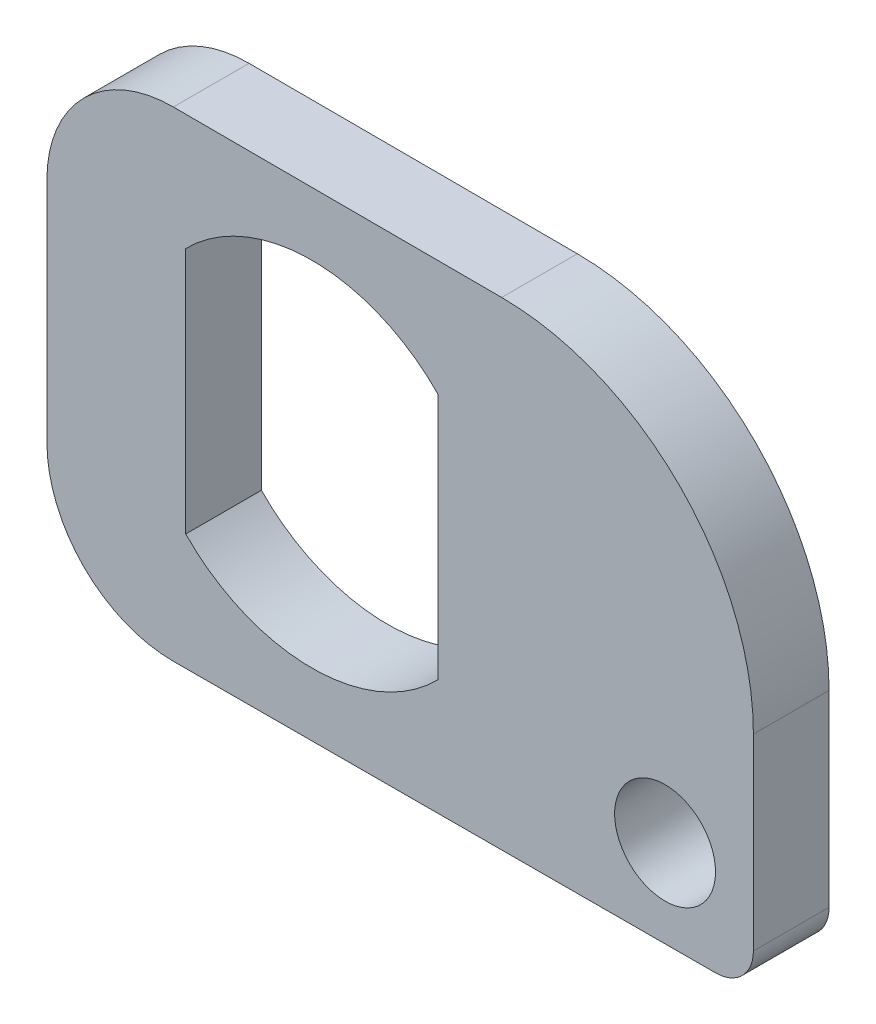
ISO-10303-21;
HEADER;
FILE_DESCRIPTION(('STEP AP214'),'2;1');
FILE_NAME('part.step','',(''),(''),'','','');
FILE_SCHEMA(('AUTOMOTIVE_DESIGN { 1 0 10303 214 1 1 1 1 }'));
ENDSEC;
DATA;
#1=APPLICATION_CONTEXT('core data for automotive mechanical design processes');
#2=APPLICATION_PROTOCOL_DEFINITION('international standard','automotive_design',2000,#1);
#3=PRODUCT_CONTEXT('',#1,'mechanical');
#4=PRODUCT('Part','Part','',(#3));
#5=PRODUCT_RELATED_PRODUCT_CATEGORY('part','',(#4));
#6=PRODUCT_DEFINITION_FORMATION('','',#4);
#7=PRODUCT_DEFINITION_CONTEXT('part definition',#1,'design');
#8=PRODUCT_DEFINITION('design','',#6,#7);
#9=PRODUCT_DEFINITION_SHAPE('','',#8);
#10=(LENGTH_UNIT() NAMED_UNIT(*) SI_UNIT(.MILLI.,.METRE.));
#11=(NAMED_UNIT(*) PLANE_ANGLE_UNIT() SI_UNIT($,.RADIAN.));
#12=(NAMED_UNIT(*) SI_UNIT($,.STERADIAN.) SOLID_ANGLE_UNIT());
#13=UNCERTAINTY_MEASURE_WITH_UNIT(LENGTH_MEASURE(1.E-05),#10,'distance_accuracy_value','');
#14=(GEOMETRIC_REPRESENTATION_CONTEXT(3) GLOBAL_UNCERTAINTY_ASSIGNED_CONTEXT((#13)) GLOBAL_UNIT_ASSIGNED_CONTEXT((#10,
#11,#12)) REPRESENTATION_CONTEXT('',''));
#15=CARTESIAN_POINT('',(0.,0.,0.));
#16=DIRECTION('',(0.,0.,1.));
#17=DIRECTION('',(1.,0.,0.));
#18=AXIS2_PLACEMENT_3D('',#15,#16,#17);
#19=CARTESIAN_POINT('',(-11.,-9.02618778250141,6.));
#20=DIRECTION('',(0.,0.,-1.));
#21=DIRECTION('',(-1.,0.,0.));
#22=AXIS2_PLACEMENT_3D('',#19,#20,#21);
#23=PLANE('',#22);
#24=CARTESIAN_POINT('',(-11.,-9.02618778250141,6.));
#25=DIRECTION('',(0.,0.,1.));
#26=DIRECTION('',(-1.,0.,0.));
#27=AXIS2_PLACEMENT_3D('',#24,#25,#26);
#28=CIRCLE('',#27,10.);
#29=CARTESIAN_POINT('',(-21.,-9.02618778250134,6.));
#30=VERTEX_POINT('',#29);
#31=CARTESIAN_POINT('',(-10.9762161335063,-19.0261594988461,6.));
#32=VERTEX_POINT('',#31);
#33=EDGE_CURVE('E165',#30,#32,#28,.T.);
#34=ORIENTED_EDGE('',*,*,#33,.T.);
#35=DIRECTION('',(0.999997171634473,0.00237838664936815,0.));
#36=VECTOR('',#35,1.);
#37=CARTESIAN_POINT('',(32.0071351599481,-18.9239281808372,6.));
#38=LINE('',#37,#36);
#39=CARTESIAN_POINT('',(32.0071351599481,-18.9239281808372,6.));
#40=VERTEX_POINT('',#39);
#41=EDGE_CURVE('E168',#32,#40,#38,.T.);
#42=ORIENTED_EDGE('',*,*,#41,.T.);
#43=CARTESIAN_POINT('',(32.,-15.9239366659337,6.));
#44=DIRECTION('',(0.,0.,1.));
#45=DIRECTION('',(1.,0.,0.));
#46=AXIS2_PLACEMENT_3D('',#43,#44,#45);
#47=CIRCLE('',#46,3.);
#48=CARTESIAN_POINT('',(35.,-15.9239366659337,6.));
#49=VERTEX_POINT('',#48);
#50=EDGE_CURVE('E171',#40,#49,#47,.T.);
#51=ORIENTED_EDGE('',*,*,#50,.T.);
#52=DIRECTION('',(0.,1.,0.));
#53=VECTOR('',#52,1.);
#54=CARTESIAN_POINT('',(35.,-1.03567872901867,6.));
#55=LINE('',#54,#53);
#56=CARTESIAN_POINT('',(35.,-1.03567872901867,6.));
#57=VERTEX_POINT('',#56);
#58=EDGE_CURVE('E173',#49,#57,#55,.T.);
#59=ORIENTED_EDGE('',*,*,#58,.T.);
#60=CARTESIAN_POINT('',(15.,-1.03567872901854,6.));
#61=DIRECTION('',(0.,0.,1.));
#62=DIRECTION('',(-1.,0.,0.));
#63=AXIS2_PLACEMENT_3D('',#60,#61,#62);
#64=CIRCLE('',#63,20.);
#65=CARTESIAN_POINT('',(15.0475677329872,18.9642647036709,6.));
#66=VERTEX_POINT('',#65);
#67=EDGE_CURVE('E175',#57,#66,#64,.T.);
#68=ORIENTED_EDGE('',*,*,#67,.T.);
#69=DIRECTION('',(-0.999997171634473,0.00237838664936795,0.));
#70=VECTOR('',#69,1.);
#71=CARTESIAN_POINT('',(15.0475677329872,18.9642647036709,6.));
#72=LINE('',#71,#70);
#73=CARTESIAN_POINT('',(-10.9762161335063,19.0261594988461,6.));
#74=VERTEX_POINT('',#73);
#75=EDGE_CURVE('E177',#66,#74,#72,.T.);
#76=ORIENTED_EDGE('',*,*,#75,.T.);
#77=CARTESIAN_POINT('',(-11.,9.02618778250141,6.));
#78=DIRECTION('',(0.,0.,1.));
#79=DIRECTION('',(1.,0.,0.));
#80=AXIS2_PLACEMENT_3D('',#77,#78,#79);
#81=CIRCLE('',#80,10.);
#82=CARTESIAN_POINT('',(-21.,9.02618778250135,6.));
#83=VERTEX_POINT('',#82);
#84=EDGE_CURVE('E179',#74,#83,#81,.T.);
#85=ORIENTED_EDGE('',*,*,#84,.T.);
#86=DIRECTION('',(0.,-1.,0.));
#87=VECTOR('',#86,1.);
#88=CARTESIAN_POINT('',(-21.,9.02618778250134,6.));
#89=LINE('',#88,#87);
#90=EDGE_CURVE('E181',#83,#30,#89,.T.);
#91=ORIENTED_EDGE('',*,*,#90,.T.);
#92=EDGE_LOOP('',(#34,#42,#51,#59,#68,#76,#85,#91));
#93=FACE_BOUND('',#92,.T.);
#94=CARTESIAN_POINT('',(0.,0.,6.));
#95=DIRECTION('',(0.,0.,1.));
#96=DIRECTION('',(1.,0.,0.));
#97=AXIS2_PLACEMENT_3D('',#94,#95,#96);
#98=CIRCLE('',#97,14.);
#99=CARTESIAN_POINT('',(10.,9.79795897113272,6.));
#100=VERTEX_POINT('',#99);
#101=CARTESIAN_POINT('',(-10.,9.79795897113272,6.));
#102=VERTEX_POINT('',#101);
#103=EDGE_CURVE('E126',#100,#102,#98,.T.);
#104=ORIENTED_EDGE('',*,*,#103,.F.);
#105=DIRECTION('',(0.,1.,0.));
#106=VECTOR('',#105,1.);
#107=CARTESIAN_POINT('',(10.,9.79795897113272,6.));
#108=LINE('',#107,#106);
#109=CARTESIAN_POINT('',(10.,-9.79795897113271,6.));
#110=VERTEX_POINT('',#109);
#111=EDGE_CURVE('E149',#110,#100,#108,.T.);
#112=ORIENTED_EDGE('',*,*,#111,.F.);
#113=CARTESIAN_POINT('',(0.,0.,6.));
#114=DIRECTION('',(0.,0.,1.));
#115=DIRECTION('',(1.,0.,0.));
#116=AXIS2_PLACEMENT_3D('',#113,#114,#115);
#117=CIRCLE('',#116,14.);
#118=CARTESIAN_POINT('',(-10.,-9.79795897113271,6.));
#119=VERTEX_POINT('',#118);
#120=EDGE_CURVE('E147',#119,#110,#117,.T.);
#121=ORIENTED_EDGE('',*,*,#120,.F.);
#122=DIRECTION('',(0.,-1.,0.));
#123=VECTOR('',#122,1.);
#124=CARTESIAN_POINT('',(-10.,9.79795897113272,6.));
#125=LINE('',#124,#123);
#126=EDGE_CURVE('E134',#102,#119,#125,.T.);
#127=ORIENTED_EDGE('',*,*,#126,.F.);
#128=EDGE_LOOP('',(#104,#112,#121,#127));
#129=FACE_BOUND('',#128,.T.);
#130=CARTESIAN_POINT('',(28.,-12.,6.));
#131=DIRECTION('',(0.,0.,1.));
#132=DIRECTION('',(1.,0.,0.));
#133=AXIS2_PLACEMENT_3D('',#130,#131,#132);
#134=CIRCLE('',#133,4.);
#135=CARTESIAN_POINT('',(32.,-12.,6.));
#136=VERTEX_POINT('',#135);
#137=EDGE_CURVE('E155',#136,#136,#134,.T.);
#138=ORIENTED_EDGE('',*,*,#137,.F.);
#139=EDGE_LOOP('',(#138));
#140=FACE_BOUND('',#139,.T.);
#141=ADVANCED_FACE('F37',(#93,#129,#140),#23,.F.);
#142=CARTESIAN_POINT('',(-11.,-9.02618778250141,0.));
#143=DIRECTION('',(0.,0.,-1.));
#144=DIRECTION('',(-1.,0.,0.));
#145=AXIS2_PLACEMENT_3D('',#142,#143,#144);
#146=PLANE('',#145);
#147=DIRECTION('',(0.,1.,0.));
#148=VECTOR('',#147,1.);
#149=CARTESIAN_POINT('',(10.,9.79795897113272,0.));
#150=LINE('',#149,#148);
#151=CARTESIAN_POINT('',(10.,-9.79795897113271,0.));
#152=VERTEX_POINT('',#151);
#153=CARTESIAN_POINT('',(10.,9.79795897113271,0.));
#154=VERTEX_POINT('',#153);
#155=EDGE_CURVE('E135',#152,#154,#150,.T.);
#156=ORIENTED_EDGE('',*,*,#155,.T.);
#157=CARTESIAN_POINT('',(0.,0.,0.));
#158=DIRECTION('',(0.,0.,1.));
#159=DIRECTION('',(1.,0.,0.));
#160=AXIS2_PLACEMENT_3D('',#157,#158,#159);
#161=CIRCLE('',#160,14.);
#162=CARTESIAN_POINT('',(-10.,9.79795897113272,0.));
#163=VERTEX_POINT('',#162);
#164=EDGE_CURVE('E60',#154,#163,#161,.T.);
#165=ORIENTED_EDGE('',*,*,#164,.T.);
#166=DIRECTION('',(0.,-1.,0.));
#167=VECTOR('',#166,1.);
#168=CARTESIAN_POINT('',(-10.,9.79795897113272,0.));
#169=LINE('',#168,#167);
#170=CARTESIAN_POINT('',(-10.,-9.79795897113271,0.));
#171=VERTEX_POINT('',#170);
#172=EDGE_CURVE('E141',#163,#171,#169,.T.);
#173=ORIENTED_EDGE('',*,*,#172,.T.);
#174=CARTESIAN_POINT('',(0.,0.,0.));
#175=DIRECTION('',(0.,0.,1.));
#176=DIRECTION('',(1.,0.,0.));
#177=AXIS2_PLACEMENT_3D('',#174,#175,#176);
#178=CIRCLE('',#177,14.);
#179=EDGE_CURVE('E157',#171,#152,#178,.T.);
#180=ORIENTED_EDGE('',*,*,#179,.T.);
#181=EDGE_LOOP('',(#156,#165,#173,#180));
#182=FACE_BOUND('',#181,.T.);
#183=CARTESIAN_POINT('',(-11.,-9.02618778250141,0.));
#184=DIRECTION('',(0.,0.,1.));
#185=DIRECTION('',(-1.,0.,0.));
#186=AXIS2_PLACEMENT_3D('',#183,#184,#185);
#187=CIRCLE('',#186,10.);
#188=CARTESIAN_POINT('',(-21.,-9.02618778250134,0.));
#189=VERTEX_POINT('',#188);
#190=CARTESIAN_POINT('',(-10.9762161335063,-19.0261594988461,0.));
#191=VERTEX_POINT('',#190);
#192=EDGE_CURVE('E142',#189,#191,#187,.T.);
#193=ORIENTED_EDGE('',*,*,#192,.F.);
#194=DIRECTION('',(0.,-1.,0.));
#195=VECTOR('',#194,1.);
#196=CARTESIAN_POINT('',(-21.,9.02618778250134,0.));
#197=LINE('',#196,#195);
#198=CARTESIAN_POINT('',(-21.,9.02618778250135,0.));
#199=VERTEX_POINT('',#198);
#200=EDGE_CURVE('E169',#199,#189,#197,.T.);
#201=ORIENTED_EDGE('',*,*,#200,.F.);
#202=CARTESIAN_POINT('',(-11.,9.02618778250141,0.));
#203=DIRECTION('',(0.,0.,1.));
#204=DIRECTION('',(1.,0.,0.));
#205=AXIS2_PLACEMENT_3D('',#202,#203,#204);
#206=CIRCLE('',#205,10.);
#207=CARTESIAN_POINT('',(-10.9762161335063,19.0261594988461,0.));
#208=VERTEX_POINT('',#207);
#209=EDGE_CURVE('E196',#208,#199,#206,.T.);
#210=ORIENTED_EDGE('',*,*,#209,.F.);
#211=DIRECTION('',(-0.999997171634473,0.00237838664936795,0.));
#212=VECTOR('',#211,1.);
#213=CARTESIAN_POINT('',(15.0475677329872,18.9642647036709,0.));
#214=LINE('',#213,#212);
#215=CARTESIAN_POINT('',(15.0475677329872,18.9642647036709,0.));
#216=VERTEX_POINT('',#215);
#217=EDGE_CURVE('E194',#216,#208,#214,.T.);
#218=ORIENTED_EDGE('',*,*,#217,.F.);
#219=CARTESIAN_POINT('',(15.,-1.03567872901854,0.));
#220=DIRECTION('',(0.,0.,1.));
#221=DIRECTION('',(-1.,0.,0.));
#222=AXIS2_PLACEMENT_3D('',#219,#220,#221);
#223=CIRCLE('',#222,20.);
#224=CARTESIAN_POINT('',(35.,-1.03567872901867,0.));
#225=VERTEX_POINT('',#224);
#226=EDGE_CURVE('E192',#225,#216,#223,.T.);
#227=ORIENTED_EDGE('',*,*,#226,.F.);
#228=DIRECTION('',(0.,1.,0.));
#229=VECTOR('',#228,1.);
#230=CARTESIAN_POINT('',(35.,-1.03567872901867,0.));
#231=LINE('',#230,#229);
#232=CARTESIAN_POINT('',(35.,-15.9239366659337,0.));
#233=VERTEX_POINT('',#232);
#234=EDGE_CURVE('E190',#233,#225,#231,.T.);
#235=ORIENTED_EDGE('',*,*,#234,.F.);
#236=CARTESIAN_POINT('',(32.,-15.9239366659337,0.));
#237=DIRECTION('',(0.,0.,1.));
#238=DIRECTION('',(1.,0.,0.));
#239=AXIS2_PLACEMENT_3D('',#236,#237,#238);
#240=CIRCLE('',#239,3.);
#241=CARTESIAN_POINT('',(32.0071351599481,-18.9239281808372,0.));
#242=VERTEX_POINT('',#241);
#243=EDGE_CURVE('E188',#242,#233,#240,.T.);
#244=ORIENTED_EDGE('',*,*,#243,.F.);
#245=DIRECTION('',(0.999997171634473,0.00237838664936815,0.));
#246=VECTOR('',#245,1.);
#247=CARTESIAN_POINT('',(32.0071351599481,-18.9239281808372,0.));
#248=LINE('',#247,#246);
#249=EDGE_CURVE('E186',#191,#242,#248,.T.);
#250=ORIENTED_EDGE('',*,*,#249,.F.);
#251=EDGE_LOOP('',(#193,#201,#210,#218,#227,#235,#244,#250));
#252=FACE_BOUND('',#251,.T.);
#253=CARTESIAN_POINT('',(28.,-12.,0.));
#254=DIRECTION('',(0.,0.,1.));
#255=DIRECTION('',(1.,0.,0.));
#256=AXIS2_PLACEMENT_3D('',#253,#254,#255);
#257=CIRCLE('',#256,4.);
#258=CARTESIAN_POINT('',(32.,-12.,0.));
#259=VERTEX_POINT('',#258);
#260=EDGE_CURVE('E302',#259,#259,#257,.T.);
#261=ORIENTED_EDGE('',*,*,#260,.T.);
#262=EDGE_LOOP('',(#261));
#263=FACE_BOUND('',#262,.T.);
#264=ADVANCED_FACE('F226',(#182,#252,#263),#146,.T.);
#265=CARTESIAN_POINT('',(-11.,-9.02618778250141,6.));
#266=DIRECTION('',(0.,0.,-1.));
#267=DIRECTION('',(-1.,0.,0.));
#268=AXIS2_PLACEMENT_3D('',#265,#266,#267);
#269=CYLINDRICAL_SURFACE('',#268,10.);
#270=ORIENTED_EDGE('',*,*,#192,.T.);
#271=DIRECTION('',(0.,0.,-1.));
#272=VECTOR('',#271,1.);
#273=CARTESIAN_POINT('',(-10.9762161335063,-19.0261594988461,6.));
#274=LINE('',#273,#272);
#275=EDGE_CURVE('E11',#32,#191,#274,.T.);
#276=ORIENTED_EDGE('',*,*,#275,.F.);
#277=ORIENTED_EDGE('',*,*,#33,.F.);
#278=DIRECTION('',(0.,0.,-1.));
#279=VECTOR('',#278,1.);
#280=CARTESIAN_POINT('',(-21.,-9.02618778250134,6.));
#281=LINE('',#280,#279);
#282=EDGE_CURVE('E183',#30,#189,#281,.T.);
#283=ORIENTED_EDGE('',*,*,#282,.T.);
#284=EDGE_LOOP('',(#270,#276,#277,#283));
#285=FACE_BOUND('',#284,.T.);
#286=ADVANCED_FACE('F39',(#285),#269,.T.);
#287=CARTESIAN_POINT('',(32.0071351599481,-18.9239281808372,6.));
#288=DIRECTION('',(-0.00237838664936814,0.999997171634473,0.));
#289=DIRECTION('',(-0.999997171634473,-0.00237838664936815,0.));
#290=AXIS2_PLACEMENT_3D('',#287,#288,#289);
#291=PLANE('',#290);
#292=ORIENTED_EDGE('',*,*,#249,.T.);
#293=DIRECTION('',(0.,0.,-1.));
#294=VECTOR('',#293,1.);
#295=CARTESIAN_POINT('',(32.0071351599481,-18.9239281808372,6.));
#296=LINE('',#295,#294);
#297=EDGE_CURVE('E45',#40,#242,#296,.T.);
#298=ORIENTED_EDGE('',*,*,#297,.F.);
#299=ORIENTED_EDGE('',*,*,#41,.F.);
#300=ORIENTED_EDGE('',*,*,#275,.T.);
#301=EDGE_LOOP('',(#292,#298,#299,#300));
#302=FACE_BOUND('',#301,.T.);
#303=ADVANCED_FACE('F243',(#302),#291,.F.);
#304=CARTESIAN_POINT('',(32.,-15.9239366659337,6.));
#305=DIRECTION('',(0.,0.,-1.));
#306=DIRECTION('',(-1.,0.,0.));
#307=AXIS2_PLACEMENT_3D('',#304,#305,#306);
#308=CYLINDRICAL_SURFACE('',#307,3.);
#309=ORIENTED_EDGE('',*,*,#243,.T.);
#310=DIRECTION('',(0.,0.,-1.));
#311=VECTOR('',#310,1.);
#312=CARTESIAN_POINT('',(35.,-15.9239366659337,6.));
#313=LINE('',#312,#311);
#314=EDGE_CURVE('E213',#49,#233,#313,.T.);
#315=ORIENTED_EDGE('',*,*,#314,.F.);
#316=ORIENTED_EDGE('',*,*,#50,.F.);
#317=ORIENTED_EDGE('',*,*,#297,.T.);
#318=EDGE_LOOP('',(#309,#315,#316,#317));
#319=FACE_BOUND('',#318,.T.);
#320=ADVANCED_FACE('F220',(#319),#308,.T.);
#321=CARTESIAN_POINT('',(35.,-1.03567872901867,6.));
#322=DIRECTION('',(-1.,0.,0.));
#323=DIRECTION('',(0.,0.,1.));
#324=AXIS2_PLACEMENT_3D('',#321,#322,#323);
#325=PLANE('',#324);
#326=ORIENTED_EDGE('',*,*,#234,.T.);
#327=DIRECTION('',(0.,0.,-1.));
#328=VECTOR('',#327,1.);
#329=CARTESIAN_POINT('',(35.,-1.03567872901867,6.));
#330=LINE('',#329,#328);
#331=EDGE_CURVE('E210',#57,#225,#330,.T.);
#332=ORIENTED_EDGE('',*,*,#331,.F.);
#333=ORIENTED_EDGE('',*,*,#58,.F.);
#334=ORIENTED_EDGE('',*,*,#314,.T.);
#335=EDGE_LOOP('',(#326,#332,#333,#334));
#336=FACE_BOUND('',#335,.T.);
#337=ADVANCED_FACE('F232',(#336),#325,.F.);
#338=CARTESIAN_POINT('',(15.,-1.03567872901854,6.));
#339=DIRECTION('',(0.,0.,-1.));
#340=DIRECTION('',(-1.,0.,0.));
#341=AXIS2_PLACEMENT_3D('',#338,#339,#340);
#342=CYLINDRICAL_SURFACE('',#341,20.);
#343=ORIENTED_EDGE('',*,*,#226,.T.);
#344=DIRECTION('',(0.,0.,-1.));
#345=VECTOR('',#344,1.);
#346=CARTESIAN_POINT('',(15.0475677329872,18.9642647036709,6.));
#347=LINE('',#346,#345);
#348=EDGE_CURVE('E207',#66,#216,#347,.T.);
#349=ORIENTED_EDGE('',*,*,#348,.F.);
#350=ORIENTED_EDGE('',*,*,#67,.F.);
#351=ORIENTED_EDGE('',*,*,#331,.T.);
#352=EDGE_LOOP('',(#343,#349,#350,#351));
#353=FACE_BOUND('',#352,.T.);
#354=ADVANCED_FACE('F236',(#353),#342,.T.);
#355=CARTESIAN_POINT('',(15.0475677329872,18.9642647036709,6.));
#356=DIRECTION('',(-0.00237838664936795,-0.999997171634473,0.));
#357=DIRECTION('',(0.999997171634473,-0.00237838664936795,0.));
#358=AXIS2_PLACEMENT_3D('',#355,#356,#357);
#359=PLANE('',#358);
#360=ORIENTED_EDGE('',*,*,#217,.T.);
#361=DIRECTION('',(0.,0.,-1.));
#362=VECTOR('',#361,1.);
#363=CARTESIAN_POINT('',(-10.9762161335063,19.0261594988461,6.));
#364=LINE('',#363,#362);
#365=EDGE_CURVE('E204',#74,#208,#364,.T.);
#366=ORIENTED_EDGE('',*,*,#365,.F.);
#367=ORIENTED_EDGE('',*,*,#75,.F.);
#368=ORIENTED_EDGE('',*,*,#348,.T.);
#369=EDGE_LOOP('',(#360,#366,#367,#368));
#370=FACE_BOUND('',#369,.T.);
#371=ADVANCED_FACE('F256',(#370),#359,.F.);
#372=CARTESIAN_POINT('',(-11.,9.02618778250141,6.));
#373=DIRECTION('',(0.,0.,-1.));
#374=DIRECTION('',(-1.,0.,0.));
#375=AXIS2_PLACEMENT_3D('',#372,#373,#374);
#376=CYLINDRICAL_SURFACE('',#375,10.);
#377=ORIENTED_EDGE('',*,*,#209,.T.);
#378=DIRECTION('',(0.,0.,-1.));
#379=VECTOR('',#378,1.);
#380=CARTESIAN_POINT('',(-21.,9.02618778250135,6.));
#381=LINE('',#380,#379);
#382=EDGE_CURVE('E201',#83,#199,#381,.T.);
#383=ORIENTED_EDGE('',*,*,#382,.F.);
#384=ORIENTED_EDGE('',*,*,#84,.F.);
#385=ORIENTED_EDGE('',*,*,#365,.T.);
#386=EDGE_LOOP('',(#377,#383,#384,#385));
#387=FACE_BOUND('',#386,.T.);
#388=ADVANCED_FACE('F254',(#387),#376,.T.);
#389=CARTESIAN_POINT('',(-21.,9.02618778250134,6.));
#390=DIRECTION('',(1.,0.,0.));
#391=DIRECTION('',(0.,1.,0.));
#392=AXIS2_PLACEMENT_3D('',#389,#390,#391);
#393=PLANE('',#392);
#394=ORIENTED_EDGE('',*,*,#200,.T.);
#395=ORIENTED_EDGE('',*,*,#282,.F.);
#396=ORIENTED_EDGE('',*,*,#90,.F.);
#397=ORIENTED_EDGE('',*,*,#382,.T.);
#398=EDGE_LOOP('',(#394,#395,#396,#397));
#399=FACE_BOUND('',#398,.T.);
#400=ADVANCED_FACE('F249',(#399),#393,.F.);
#401=CARTESIAN_POINT('',(0.,0.,6.));
#402=DIRECTION('',(0.,0.,-1.));
#403=DIRECTION('',(-1.,0.,0.));
#404=AXIS2_PLACEMENT_3D('',#401,#402,#403);
#405=CYLINDRICAL_SURFACE('',#404,14.);
#406=ORIENTED_EDGE('',*,*,#164,.F.);
#407=DIRECTION('',(0.,0.,-1.));
#408=VECTOR('',#407,1.);
#409=CARTESIAN_POINT('',(10.,9.79795897113272,6.));
#410=LINE('',#409,#408);
#411=EDGE_CURVE('E130',#100,#154,#410,.T.);
#412=ORIENTED_EDGE('',*,*,#411,.F.);
#413=ORIENTED_EDGE('',*,*,#103,.T.);
#414=DIRECTION('',(0.,0.,-1.));
#415=VECTOR('',#414,1.);
#416=CARTESIAN_POINT('',(-10.,9.79795897113272,6.));
#417=LINE('',#416,#415);
#418=EDGE_CURVE('E129',#102,#163,#417,.T.);
#419=ORIENTED_EDGE('',*,*,#418,.T.);
#420=EDGE_LOOP('',(#406,#412,#413,#419));
#421=FACE_BOUND('',#420,.T.);
#422=ADVANCED_FACE('F128',(#421),#405,.F.);
#423=CARTESIAN_POINT('',(-10.,9.79795897113272,6.));
#424=DIRECTION('',(1.,0.,0.));
#425=DIRECTION('',(0.,1.,0.));
#426=AXIS2_PLACEMENT_3D('',#423,#424,#425);
#427=PLANE('',#426);
#428=ORIENTED_EDGE('',*,*,#172,.F.);
#429=ORIENTED_EDGE('',*,*,#418,.F.);
#430=ORIENTED_EDGE('',*,*,#126,.T.);
#431=DIRECTION('',(0.,0.,-1.));
#432=VECTOR('',#431,1.);
#433=CARTESIAN_POINT('',(-10.,-9.79795897113271,6.));
#434=LINE('',#433,#432);
#435=EDGE_CURVE('E143',#119,#171,#434,.T.);
#436=ORIENTED_EDGE('',*,*,#435,.T.);
#437=EDGE_LOOP('',(#428,#429,#430,#436));
#438=FACE_BOUND('',#437,.T.);
#439=ADVANCED_FACE('F138',(#438),#427,.T.);
#440=CARTESIAN_POINT('',(0.,0.,6.));
#441=DIRECTION('',(0.,0.,-1.));
#442=DIRECTION('',(-1.,0.,0.));
#443=AXIS2_PLACEMENT_3D('',#440,#441,#442);
#444=CYLINDRICAL_SURFACE('',#443,14.);
#445=ORIENTED_EDGE('',*,*,#179,.F.);
#446=ORIENTED_EDGE('',*,*,#435,.F.);
#447=ORIENTED_EDGE('',*,*,#120,.T.);
#448=DIRECTION('',(0.,0.,-1.));
#449=VECTOR('',#448,1.);
#450=CARTESIAN_POINT('',(10.,-9.79795897113271,6.));
#451=LINE('',#450,#449);
#452=EDGE_CURVE('E52',#110,#152,#451,.T.);
#453=ORIENTED_EDGE('',*,*,#452,.T.);
#454=EDGE_LOOP('',(#445,#446,#447,#453));
#455=FACE_BOUND('',#454,.T.);
#456=ADVANCED_FACE('F282',(#455),#444,.F.);
#457=CARTESIAN_POINT('',(10.,9.79795897113272,6.));
#458=DIRECTION('',(-1.,0.,0.));
#459=DIRECTION('',(0.,-1.,0.));
#460=AXIS2_PLACEMENT_3D('',#457,#458,#459);
#461=PLANE('',#460);
#462=ORIENTED_EDGE('',*,*,#155,.F.);
#463=ORIENTED_EDGE('',*,*,#452,.F.);
#464=ORIENTED_EDGE('',*,*,#111,.T.);
#465=ORIENTED_EDGE('',*,*,#411,.T.);
#466=EDGE_LOOP('',(#462,#463,#464,#465));
#467=FACE_BOUND('',#466,.T.);
#468=ADVANCED_FACE('F286',(#467),#461,.T.);
#469=CARTESIAN_POINT('',(28.,-12.,6.));
#470=DIRECTION('',(0.,0.,-1.));
#471=DIRECTION('',(-1.,0.,0.));
#472=AXIS2_PLACEMENT_3D('',#469,#470,#471);
#473=CYLINDRICAL_SURFACE('',#472,4.);
#474=ORIENTED_EDGE('',*,*,#137,.T.);
#475=EDGE_LOOP('',(#474));
#476=FACE_BOUND('',#475,.T.);
#477=ORIENTED_EDGE('',*,*,#260,.F.);
#478=EDGE_LOOP('',(#477));
#479=FACE_BOUND('',#478,.T.);
#480=ADVANCED_FACE('F292',(#476,#479),#473,.F.);
#481=CLOSED_SHELL('',(#141,#264,#286,#303,#320,#337,#354,#371,#388,#400,#422,#439,#456,#468,#480));
#482=MANIFOLD_SOLID_BREP('B2',#481);
#483=ADVANCED_BREP_SHAPE_REPRESENTATION('',(#18,#482),#14);
#484=SHAPE_DEFINITION_REPRESENTATION(#9,#483);
ENDSEC;
END-ISO-10303-21;
